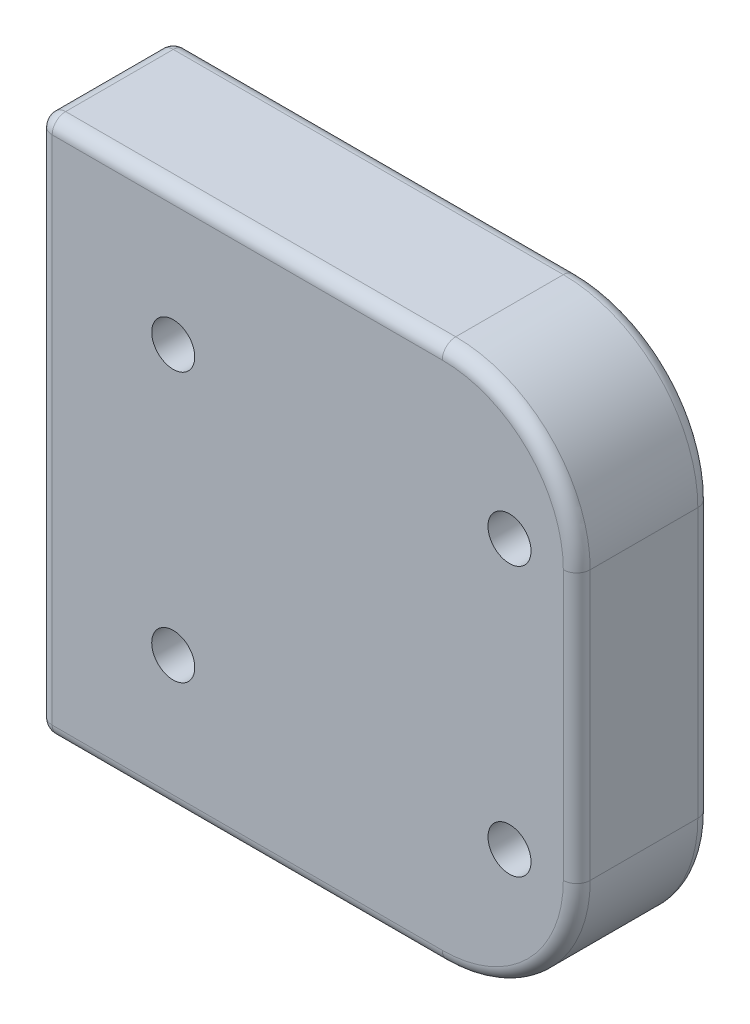
ISO-10303-21;
HEADER;
FILE_DESCRIPTION(('STEP AP214'),'2;1');
FILE_NAME('part.step','',(''),(''),'','','');
FILE_SCHEMA(('AUTOMOTIVE_DESIGN { 1 0 10303 214 1 1 1 1 }'));
ENDSEC;
DATA;
#1=APPLICATION_CONTEXT('core data for automotive mechanical design processes');
#2=APPLICATION_PROTOCOL_DEFINITION('international standard','automotive_design',2000,#1);
#3=PRODUCT_CONTEXT('',#1,'mechanical');
#4=PRODUCT('Part','Part','',(#3));
#5=PRODUCT_RELATED_PRODUCT_CATEGORY('part','',(#4));
#6=PRODUCT_DEFINITION_FORMATION('','',#4);
#7=PRODUCT_DEFINITION_CONTEXT('part definition',#1,'design');
#8=PRODUCT_DEFINITION('design','',#6,#7);
#9=PRODUCT_DEFINITION_SHAPE('','',#8);
#10=(LENGTH_UNIT() NAMED_UNIT(*) SI_UNIT(.MILLI.,.METRE.));
#11=(NAMED_UNIT(*) PLANE_ANGLE_UNIT() SI_UNIT($,.RADIAN.));
#12=(NAMED_UNIT(*) SI_UNIT($,.STERADIAN.) SOLID_ANGLE_UNIT());
#13=UNCERTAINTY_MEASURE_WITH_UNIT(LENGTH_MEASURE(1.E-05),#10,'distance_accuracy_value','');
#14=(GEOMETRIC_REPRESENTATION_CONTEXT(3) GLOBAL_UNCERTAINTY_ASSIGNED_CONTEXT((#13)) GLOBAL_UNIT_ASSIGNED_CONTEXT((#10,
#11,#12)) REPRESENTATION_CONTEXT('',''));
#15=CARTESIAN_POINT('',(0.,0.,0.));
#16=DIRECTION('',(0.,0.,1.));
#17=DIRECTION('',(1.,0.,0.));
#18=AXIS2_PLACEMENT_3D('',#15,#16,#17);
#19=CARTESIAN_POINT('',(20.,-20.,10.));
#20=DIRECTION('',(-1.,0.,0.));
#21=DIRECTION('',(0.,0.,1.));
#22=AXIS2_PLACEMENT_3D('',#19,#20,#21);
#23=PLANE('',#22);
#24=DIRECTION('',(0.,0.,-1.));
#25=VECTOR('',#24,1.);
#26=CARTESIAN_POINT('',(20.,-10.,10.));
#27=LINE('',#26,#25);
#28=CARTESIAN_POINT('',(20.,-10.,9.));
#29=VERTEX_POINT('',#28);
#30=CARTESIAN_POINT('',(20.,-10.,0.999999999999999));
#31=VERTEX_POINT('',#30);
#32=EDGE_CURVE('E174',#29,#31,#27,.T.);
#33=ORIENTED_EDGE('',*,*,#32,.T.);
#34=DIRECTION('',(0.,1.,0.));
#35=VECTOR('',#34,1.);
#36=CARTESIAN_POINT('',(20.,10.,0.999999999999999));
#37=LINE('',#36,#35);
#38=CARTESIAN_POINT('',(20.,10.,0.999999999999999));
#39=VERTEX_POINT('',#38);
#40=EDGE_CURVE('E195',#31,#39,#37,.T.);
#41=ORIENTED_EDGE('',*,*,#40,.T.);
#42=DIRECTION('',(0.,0.,-1.));
#43=VECTOR('',#42,1.);
#44=CARTESIAN_POINT('',(20.,10.,10.));
#45=LINE('',#44,#43);
#46=CARTESIAN_POINT('',(20.,10.,9.));
#47=VERTEX_POINT('',#46);
#48=EDGE_CURVE('E177',#39,#47,#45,.F.);
#49=ORIENTED_EDGE('',*,*,#48,.T.);
#50=DIRECTION('',(0.,1.,0.));
#51=VECTOR('',#50,1.);
#52=CARTESIAN_POINT('',(20.,-20.,9.));
#53=LINE('',#52,#51);
#54=EDGE_CURVE('E157',#47,#29,#53,.F.);
#55=ORIENTED_EDGE('',*,*,#54,.T.);
#56=EDGE_LOOP('',(#33,#41,#49,#55));
#57=FACE_BOUND('',#56,.T.);
#58=ADVANCED_FACE('F36',(#57),#23,.F.);
#59=CARTESIAN_POINT('',(-20.,20.,10.));
#60=DIRECTION('',(0.,-1.,0.));
#61=DIRECTION('',(0.,0.,-1.));
#62=AXIS2_PLACEMENT_3D('',#59,#60,#61);
#63=PLANE('',#62);
#64=DIRECTION('',(0.,0.,-1.));
#65=VECTOR('',#64,1.);
#66=CARTESIAN_POINT('',(10.,20.,10.));
#67=LINE('',#66,#65);
#68=CARTESIAN_POINT('',(10.,20.,9.));
#69=VERTEX_POINT('',#68);
#70=CARTESIAN_POINT('',(10.,20.,0.999999999999999));
#71=VERTEX_POINT('',#70);
#72=EDGE_CURVE('E173',#69,#71,#67,.T.);
#73=ORIENTED_EDGE('',*,*,#72,.T.);
#74=DIRECTION('',(-1.,0.,0.));
#75=VECTOR('',#74,1.);
#76=CARTESIAN_POINT('',(-20.,20.,0.999999999999999));
#77=LINE('',#76,#75);
#78=CARTESIAN_POINT('',(-19.,20.,0.999999999999999));
#79=VERTEX_POINT('',#78);
#80=EDGE_CURVE('E11',#71,#79,#77,.T.);
#81=ORIENTED_EDGE('',*,*,#80,.T.);
#82=DIRECTION('',(0.,0.,-1.));
#83=VECTOR('',#82,1.);
#84=CARTESIAN_POINT('',(-19.,20.,10.));
#85=LINE('',#84,#83);
#86=CARTESIAN_POINT('',(-19.,20.,9.));
#87=VERTEX_POINT('',#86);
#88=EDGE_CURVE('E52',#79,#87,#85,.F.);
#89=ORIENTED_EDGE('',*,*,#88,.T.);
#90=DIRECTION('',(-1.,0.,0.));
#91=VECTOR('',#90,1.);
#92=CARTESIAN_POINT('',(-20.,20.,9.));
#93=LINE('',#92,#91);
#94=EDGE_CURVE('E45',#87,#69,#93,.F.);
#95=ORIENTED_EDGE('',*,*,#94,.T.);
#96=EDGE_LOOP('',(#73,#81,#89,#95));
#97=FACE_BOUND('',#96,.T.);
#98=ADVANCED_FACE('F345',(#97),#63,.F.);
#99=CARTESIAN_POINT('',(-20.,-20.,10.));
#100=DIRECTION('',(1.,0.,0.));
#101=DIRECTION('',(0.,0.,-1.));
#102=AXIS2_PLACEMENT_3D('',#99,#100,#101);
#103=PLANE('',#102);
#104=DIRECTION('',(0.,-1.,0.));
#105=VECTOR('',#104,1.);
#106=CARTESIAN_POINT('',(-20.,-20.,0.999999999999999));
#107=LINE('',#106,#105);
#108=CARTESIAN_POINT('',(-20.,19.,0.999999999999999));
#109=VERTEX_POINT('',#108);
#110=CARTESIAN_POINT('',(-20.,-19.,0.999999999999999));
#111=VERTEX_POINT('',#110);
#112=EDGE_CURVE('E218',#109,#111,#107,.T.);
#113=ORIENTED_EDGE('',*,*,#112,.T.);
#114=DIRECTION('',(0.,0.,-1.));
#115=VECTOR('',#114,1.);
#116=CARTESIAN_POINT('',(-20.,-19.,10.));
#117=LINE('',#116,#115);
#118=CARTESIAN_POINT('',(-20.,-19.,9.));
#119=VERTEX_POINT('',#118);
#120=EDGE_CURVE('E221',#111,#119,#117,.F.);
#121=ORIENTED_EDGE('',*,*,#120,.T.);
#122=DIRECTION('',(0.,-1.,0.));
#123=VECTOR('',#122,1.);
#124=CARTESIAN_POINT('',(-20.,-20.,9.));
#125=LINE('',#124,#123);
#126=CARTESIAN_POINT('',(-20.,19.,9.));
#127=VERTEX_POINT('',#126);
#128=EDGE_CURVE('E216',#119,#127,#125,.F.);
#129=ORIENTED_EDGE('',*,*,#128,.T.);
#130=DIRECTION('',(0.,0.,-1.));
#131=VECTOR('',#130,1.);
#132=CARTESIAN_POINT('',(-20.,19.,10.));
#133=LINE('',#132,#131);
#134=EDGE_CURVE('E214',#127,#109,#133,.T.);
#135=ORIENTED_EDGE('',*,*,#134,.T.);
#136=EDGE_LOOP('',(#113,#121,#129,#135));
#137=FACE_BOUND('',#136,.T.);
#138=ADVANCED_FACE('F369',(#137),#103,.F.);
#139=CARTESIAN_POINT('',(-20.,-20.,10.));
#140=DIRECTION('',(0.,1.,0.));
#141=DIRECTION('',(0.,0.,1.));
#142=AXIS2_PLACEMENT_3D('',#139,#140,#141);
#143=PLANE('',#142);
#144=DIRECTION('',(0.,0.,-1.));
#145=VECTOR('',#144,1.);
#146=CARTESIAN_POINT('',(-19.,-20.,10.));
#147=LINE('',#146,#145);
#148=CARTESIAN_POINT('',(-19.,-20.,9.));
#149=VERTEX_POINT('',#148);
#150=CARTESIAN_POINT('',(-19.,-20.,0.999999999999999));
#151=VERTEX_POINT('',#150);
#152=EDGE_CURVE('E166',#149,#151,#147,.T.);
#153=ORIENTED_EDGE('',*,*,#152,.T.);
#154=DIRECTION('',(1.,0.,0.));
#155=VECTOR('',#154,1.);
#156=CARTESIAN_POINT('',(10.,-20.,0.999999999999999));
#157=LINE('',#156,#155);
#158=CARTESIAN_POINT('',(10.,-20.,0.999999999999999));
#159=VERTEX_POINT('',#158);
#160=EDGE_CURVE('E141',#151,#159,#157,.T.);
#161=ORIENTED_EDGE('',*,*,#160,.T.);
#162=DIRECTION('',(0.,0.,-1.));
#163=VECTOR('',#162,1.);
#164=CARTESIAN_POINT('',(10.,-20.,10.));
#165=LINE('',#164,#163);
#166=CARTESIAN_POINT('',(10.,-20.,9.));
#167=VERTEX_POINT('',#166);
#168=EDGE_CURVE('E163',#159,#167,#165,.F.);
#169=ORIENTED_EDGE('',*,*,#168,.T.);
#170=DIRECTION('',(1.,0.,0.));
#171=VECTOR('',#170,1.);
#172=CARTESIAN_POINT('',(-20.,-20.,9.));
#173=LINE('',#172,#171);
#174=EDGE_CURVE('E169',#167,#149,#173,.F.);
#175=ORIENTED_EDGE('',*,*,#174,.T.);
#176=EDGE_LOOP('',(#153,#161,#169,#175));
#177=FACE_BOUND('',#176,.T.);
#178=ADVANCED_FACE('F162',(#177),#143,.F.);
#179=CARTESIAN_POINT('',(0.,0.,10.));
#180=DIRECTION('',(0.,0.,-1.));
#181=DIRECTION('',(-1.,0.,0.));
#182=AXIS2_PLACEMENT_3D('',#179,#180,#181);
#183=PLANE('',#182);
#184=DIRECTION('',(0.,-1.,0.));
#185=VECTOR('',#184,1.);
#186=CARTESIAN_POINT('',(-19.,0.,10.));
#187=LINE('',#186,#185);
#188=CARTESIAN_POINT('',(-19.,19.,10.));
#189=VERTEX_POINT('',#188);
#190=CARTESIAN_POINT('',(-19.,-19.,10.));
#191=VERTEX_POINT('',#190);
#192=EDGE_CURVE('E201',#189,#191,#187,.T.);
#193=ORIENTED_EDGE('',*,*,#192,.T.);
#194=DIRECTION('',(1.,0.,0.));
#195=VECTOR('',#194,1.);
#196=CARTESIAN_POINT('',(0.,-19.,10.));
#197=LINE('',#196,#195);
#198=CARTESIAN_POINT('',(10.,-19.,10.));
#199=VERTEX_POINT('',#198);
#200=EDGE_CURVE('E211',#191,#199,#197,.T.);
#201=ORIENTED_EDGE('',*,*,#200,.T.);
#202=CARTESIAN_POINT('',(10.,-10.,10.));
#203=DIRECTION('',(0.,0.,-1.));
#204=DIRECTION('',(-1.,0.,0.));
#205=AXIS2_PLACEMENT_3D('',#202,#203,#204);
#206=CIRCLE('',#205,9.);
#207=CARTESIAN_POINT('',(19.,-10.,10.));
#208=VERTEX_POINT('',#207);
#209=EDGE_CURVE('E209',#199,#208,#206,.F.);
#210=ORIENTED_EDGE('',*,*,#209,.T.);
#211=DIRECTION('',(0.,1.,0.));
#212=VECTOR('',#211,1.);
#213=CARTESIAN_POINT('',(19.,0.,10.));
#214=LINE('',#213,#212);
#215=CARTESIAN_POINT('',(19.,10.,10.));
#216=VERTEX_POINT('',#215);
#217=EDGE_CURVE('E207',#208,#216,#214,.T.);
#218=ORIENTED_EDGE('',*,*,#217,.T.);
#219=CARTESIAN_POINT('',(10.,10.,10.));
#220=DIRECTION('',(0.,0.,-1.));
#221=DIRECTION('',(-1.,0.,0.));
#222=AXIS2_PLACEMENT_3D('',#219,#220,#221);
#223=CIRCLE('',#222,9.);
#224=CARTESIAN_POINT('',(10.,19.,10.));
#225=VERTEX_POINT('',#224);
#226=EDGE_CURVE('E205',#216,#225,#223,.F.);
#227=ORIENTED_EDGE('',*,*,#226,.T.);
#228=DIRECTION('',(-1.,0.,0.));
#229=VECTOR('',#228,1.);
#230=CARTESIAN_POINT('',(0.,19.,10.));
#231=LINE('',#230,#229);
#232=EDGE_CURVE('E203',#225,#189,#231,.T.);
#233=ORIENTED_EDGE('',*,*,#232,.T.);
#234=EDGE_LOOP('',(#193,#201,#210,#218,#227,#233));
#235=FACE_BOUND('',#234,.T.);
#236=CARTESIAN_POINT('',(-10.,-10.,10.));
#237=DIRECTION('',(0.,0.,1.));
#238=DIRECTION('',(-1.,0.,0.));
#239=AXIS2_PLACEMENT_3D('',#236,#237,#238);
#240=CIRCLE('',#239,1.59999999999998);
#241=CARTESIAN_POINT('',(-11.6,-10.,10.));
#242=VERTEX_POINT('',#241);
#243=EDGE_CURVE('E276',#242,#242,#240,.T.);
#244=ORIENTED_EDGE('',*,*,#243,.F.);
#245=EDGE_LOOP('',(#244));
#246=FACE_BOUND('',#245,.T.);
#247=CARTESIAN_POINT('',(15.,-10.,10.));
#248=DIRECTION('',(0.,0.,1.));
#249=DIRECTION('',(1.,0.,0.));
#250=AXIS2_PLACEMENT_3D('',#247,#248,#249);
#251=CIRCLE('',#250,1.60000000000001);
#252=CARTESIAN_POINT('',(16.6,-10.,10.));
#253=VERTEX_POINT('',#252);
#254=EDGE_CURVE('E286',#253,#253,#251,.T.);
#255=ORIENTED_EDGE('',*,*,#254,.F.);
#256=EDGE_LOOP('',(#255));
#257=FACE_BOUND('',#256,.T.);
#258=CARTESIAN_POINT('',(15.,10.,10.));
#259=DIRECTION('',(0.,0.,1.));
#260=DIRECTION('',(-1.,0.,0.));
#261=AXIS2_PLACEMENT_3D('',#258,#259,#260);
#262=CIRCLE('',#261,1.6);
#263=CARTESIAN_POINT('',(13.4,10.,10.));
#264=VERTEX_POINT('',#263);
#265=EDGE_CURVE('E626',#264,#264,#262,.T.);
#266=ORIENTED_EDGE('',*,*,#265,.F.);
#267=EDGE_LOOP('',(#266));
#268=FACE_BOUND('',#267,.T.);
#269=CARTESIAN_POINT('',(-10.,10.,10.));
#270=DIRECTION('',(0.,0.,1.));
#271=DIRECTION('',(1.,0.,0.));
#272=AXIS2_PLACEMENT_3D('',#269,#270,#271);
#273=CIRCLE('',#272,1.6);
#274=CARTESIAN_POINT('',(-8.4,10.,10.));
#275=VERTEX_POINT('',#274);
#276=EDGE_CURVE('E293',#275,#275,#273,.T.);
#277=ORIENTED_EDGE('',*,*,#276,.F.);
#278=EDGE_LOOP('',(#277));
#279=FACE_BOUND('',#278,.T.);
#280=ADVANCED_FACE('F363',(#235,#246,#257,#268,#279),#183,.F.);
#281=CARTESIAN_POINT('',(0.,0.,0.));
#282=DIRECTION('',(0.,0.,-1.));
#283=DIRECTION('',(-1.,0.,0.));
#284=AXIS2_PLACEMENT_3D('',#281,#282,#283);
#285=PLANE('',#284);
#286=CARTESIAN_POINT('',(10.,-10.,0.));
#287=DIRECTION('',(0.,0.,-1.));
#288=DIRECTION('',(-1.,0.,0.));
#289=AXIS2_PLACEMENT_3D('',#286,#287,#288);
#290=CIRCLE('',#289,9.);
#291=CARTESIAN_POINT('',(19.,-10.,0.));
#292=VERTEX_POINT('',#291);
#293=CARTESIAN_POINT('',(10.,-19.,0.));
#294=VERTEX_POINT('',#293);
#295=EDGE_CURVE('E190',#292,#294,#290,.T.);
#296=ORIENTED_EDGE('',*,*,#295,.T.);
#297=DIRECTION('',(1.,0.,0.));
#298=VECTOR('',#297,1.);
#299=CARTESIAN_POINT('',(-20.,-19.,0.));
#300=LINE('',#299,#298);
#301=CARTESIAN_POINT('',(-19.,-19.,0.));
#302=VERTEX_POINT('',#301);
#303=EDGE_CURVE('E143',#294,#302,#300,.F.);
#304=ORIENTED_EDGE('',*,*,#303,.T.);
#305=DIRECTION('',(0.,-1.,0.));
#306=VECTOR('',#305,1.);
#307=CARTESIAN_POINT('',(-19.,20.,0.));
#308=LINE('',#307,#306);
#309=CARTESIAN_POINT('',(-19.,19.,0.));
#310=VERTEX_POINT('',#309);
#311=EDGE_CURVE('E184',#302,#310,#308,.F.);
#312=ORIENTED_EDGE('',*,*,#311,.T.);
#313=DIRECTION('',(-1.,0.,0.));
#314=VECTOR('',#313,1.);
#315=CARTESIAN_POINT('',(10.,19.,0.));
#316=LINE('',#315,#314);
#317=CARTESIAN_POINT('',(10.,19.,0.));
#318=VERTEX_POINT('',#317);
#319=EDGE_CURVE('E168',#310,#318,#316,.F.);
#320=ORIENTED_EDGE('',*,*,#319,.T.);
#321=CARTESIAN_POINT('',(10.,10.,0.));
#322=DIRECTION('',(0.,0.,-1.));
#323=DIRECTION('',(-1.,0.,0.));
#324=AXIS2_PLACEMENT_3D('',#321,#322,#323);
#325=CIRCLE('',#324,9.);
#326=CARTESIAN_POINT('',(19.,10.,0.));
#327=VERTEX_POINT('',#326);
#328=EDGE_CURVE('E186',#318,#327,#325,.T.);
#329=ORIENTED_EDGE('',*,*,#328,.T.);
#330=DIRECTION('',(0.,1.,0.));
#331=VECTOR('',#330,1.);
#332=CARTESIAN_POINT('',(19.,-10.,0.));
#333=LINE('',#332,#331);
#334=EDGE_CURVE('E188',#327,#292,#333,.F.);
#335=ORIENTED_EDGE('',*,*,#334,.T.);
#336=EDGE_LOOP('',(#296,#304,#312,#320,#329,#335));
#337=FACE_BOUND('',#336,.T.);
#338=CARTESIAN_POINT('',(-10.,-10.,0.));
#339=DIRECTION('',(0.,0.,1.));
#340=DIRECTION('',(-1.,0.,0.));
#341=AXIS2_PLACEMENT_3D('',#338,#339,#340);
#342=CIRCLE('',#341,1.59999999999998);
#343=CARTESIAN_POINT('',(-11.6,-10.,0.));
#344=VERTEX_POINT('',#343);
#345=EDGE_CURVE('E281',#344,#344,#342,.T.);
#346=ORIENTED_EDGE('',*,*,#345,.T.);
#347=EDGE_LOOP('',(#346));
#348=FACE_BOUND('',#347,.T.);
#349=CARTESIAN_POINT('',(15.,-10.,0.));
#350=DIRECTION('',(0.,0.,1.));
#351=DIRECTION('',(1.,0.,0.));
#352=AXIS2_PLACEMENT_3D('',#349,#350,#351);
#353=CIRCLE('',#352,1.60000000000001);
#354=CARTESIAN_POINT('',(16.6,-10.,0.));
#355=VERTEX_POINT('',#354);
#356=EDGE_CURVE('E628',#355,#355,#353,.T.);
#357=ORIENTED_EDGE('',*,*,#356,.T.);
#358=EDGE_LOOP('',(#357));
#359=FACE_BOUND('',#358,.T.);
#360=CARTESIAN_POINT('',(15.,10.,0.));
#361=DIRECTION('',(0.,0.,1.));
#362=DIRECTION('',(-1.,0.,0.));
#363=AXIS2_PLACEMENT_3D('',#360,#361,#362);
#364=CIRCLE('',#363,1.6);
#365=CARTESIAN_POINT('',(13.4,10.,0.));
#366=VERTEX_POINT('',#365);
#367=EDGE_CURVE('E295',#366,#366,#364,.T.);
#368=ORIENTED_EDGE('',*,*,#367,.T.);
#369=EDGE_LOOP('',(#368));
#370=FACE_BOUND('',#369,.T.);
#371=CARTESIAN_POINT('',(-10.,10.,0.));
#372=DIRECTION('',(0.,0.,1.));
#373=DIRECTION('',(1.,0.,0.));
#374=AXIS2_PLACEMENT_3D('',#371,#372,#373);
#375=CIRCLE('',#374,1.6);
#376=CARTESIAN_POINT('',(-8.4,10.,0.));
#377=VERTEX_POINT('',#376);
#378=EDGE_CURVE('E290',#377,#377,#375,.T.);
#379=ORIENTED_EDGE('',*,*,#378,.T.);
#380=EDGE_LOOP('',(#379));
#381=FACE_BOUND('',#380,.T.);
#382=ADVANCED_FACE('F333',(#337,#348,#359,#370,#381),#285,.T.);
#383=CARTESIAN_POINT('',(-10.,10.,0.));
#384=DIRECTION('',(0.,0.,1.));
#385=DIRECTION('',(1.,0.,0.));
#386=AXIS2_PLACEMENT_3D('',#383,#384,#385);
#387=CYLINDRICAL_SURFACE('',#386,1.6);
#388=ORIENTED_EDGE('',*,*,#378,.F.);
#389=EDGE_LOOP('',(#388));
#390=FACE_BOUND('',#389,.T.);
#391=ORIENTED_EDGE('',*,*,#276,.T.);
#392=EDGE_LOOP('',(#391));
#393=FACE_BOUND('',#392,.T.);
#394=ADVANCED_FACE('F456',(#390,#393),#387,.F.);
#395=CARTESIAN_POINT('',(15.,10.,0.));
#396=DIRECTION('',(0.,0.,1.));
#397=DIRECTION('',(1.,0.,0.));
#398=AXIS2_PLACEMENT_3D('',#395,#396,#397);
#399=CYLINDRICAL_SURFACE('',#398,1.6);
#400=ORIENTED_EDGE('',*,*,#367,.F.);
#401=EDGE_LOOP('',(#400));
#402=FACE_BOUND('',#401,.T.);
#403=ORIENTED_EDGE('',*,*,#265,.T.);
#404=EDGE_LOOP('',(#403));
#405=FACE_BOUND('',#404,.T.);
#406=ADVANCED_FACE('F448',(#402,#405),#399,.F.);
#407=CARTESIAN_POINT('',(15.,-10.,0.));
#408=DIRECTION('',(0.,0.,1.));
#409=DIRECTION('',(1.,0.,0.));
#410=AXIS2_PLACEMENT_3D('',#407,#408,#409);
#411=CYLINDRICAL_SURFACE('',#410,1.60000000000001);
#412=ORIENTED_EDGE('',*,*,#356,.F.);
#413=EDGE_LOOP('',(#412));
#414=FACE_BOUND('',#413,.T.);
#415=ORIENTED_EDGE('',*,*,#254,.T.);
#416=EDGE_LOOP('',(#415));
#417=FACE_BOUND('',#416,.T.);
#418=ADVANCED_FACE('F440',(#414,#417),#411,.F.);
#419=CARTESIAN_POINT('',(-10.,-10.,0.));
#420=DIRECTION('',(0.,0.,1.));
#421=DIRECTION('',(1.,0.,0.));
#422=AXIS2_PLACEMENT_3D('',#419,#420,#421);
#423=CYLINDRICAL_SURFACE('',#422,1.59999999999998);
#424=ORIENTED_EDGE('',*,*,#345,.F.);
#425=EDGE_LOOP('',(#424));
#426=FACE_BOUND('',#425,.T.);
#427=ORIENTED_EDGE('',*,*,#243,.T.);
#428=EDGE_LOOP('',(#427));
#429=FACE_BOUND('',#428,.T.);
#430=ADVANCED_FACE('F385',(#426,#429),#423,.F.);
#431=CARTESIAN_POINT('',(10.,-10.,10.));
#432=DIRECTION('',(0.,0.,-1.));
#433=DIRECTION('',(-1.,0.,0.));
#434=AXIS2_PLACEMENT_3D('',#431,#432,#433);
#435=CYLINDRICAL_SURFACE('',#434,10.);
#436=ORIENTED_EDGE('',*,*,#168,.F.);
#437=CARTESIAN_POINT('',(10.,-10.,0.999999999999999));
#438=DIRECTION('',(0.,0.,-1.));
#439=DIRECTION('',(-1.,0.,0.));
#440=AXIS2_PLACEMENT_3D('',#437,#438,#439);
#441=CIRCLE('',#440,10.);
#442=EDGE_CURVE('E149',#159,#31,#441,.F.);
#443=ORIENTED_EDGE('',*,*,#442,.T.);
#444=ORIENTED_EDGE('',*,*,#32,.F.);
#445=CARTESIAN_POINT('',(10.,-10.,9.));
#446=DIRECTION('',(0.,0.,-1.));
#447=DIRECTION('',(-1.,0.,0.));
#448=AXIS2_PLACEMENT_3D('',#445,#446,#447);
#449=CIRCLE('',#448,10.);
#450=EDGE_CURVE('E158',#29,#167,#449,.T.);
#451=ORIENTED_EDGE('',*,*,#450,.T.);
#452=EDGE_LOOP('',(#436,#443,#444,#451));
#453=FACE_BOUND('',#452,.T.);
#454=ADVANCED_FACE('F171',(#453),#435,.T.);
#455=CARTESIAN_POINT('',(10.,10.,10.));
#456=DIRECTION('',(0.,0.,-1.));
#457=DIRECTION('',(-1.,0.,0.));
#458=AXIS2_PLACEMENT_3D('',#455,#456,#457);
#459=CYLINDRICAL_SURFACE('',#458,10.);
#460=ORIENTED_EDGE('',*,*,#48,.F.);
#461=CARTESIAN_POINT('',(10.,10.,0.999999999999999));
#462=DIRECTION('',(0.,0.,-1.));
#463=DIRECTION('',(-1.,0.,0.));
#464=AXIS2_PLACEMENT_3D('',#461,#462,#463);
#465=CIRCLE('',#464,10.);
#466=EDGE_CURVE('E199',#39,#71,#465,.F.);
#467=ORIENTED_EDGE('',*,*,#466,.T.);
#468=ORIENTED_EDGE('',*,*,#72,.F.);
#469=CARTESIAN_POINT('',(10.,10.,9.));
#470=DIRECTION('',(0.,0.,-1.));
#471=DIRECTION('',(-1.,0.,0.));
#472=AXIS2_PLACEMENT_3D('',#469,#470,#471);
#473=CIRCLE('',#472,10.);
#474=EDGE_CURVE('E197',#69,#47,#473,.T.);
#475=ORIENTED_EDGE('',*,*,#474,.T.);
#476=EDGE_LOOP('',(#460,#467,#468,#475));
#477=FACE_BOUND('',#476,.T.);
#478=ADVANCED_FACE('F344',(#477),#459,.T.);
#479=CARTESIAN_POINT('',(10.,10.,9.));
#480=DIRECTION('',(0.,0.,-1.));
#481=DIRECTION('',(-1.,0.,0.));
#482=AXIS2_PLACEMENT_3D('',#479,#480,#481);
#483=TOROIDAL_SURFACE('',#482,9.,1.);
#484=CARTESIAN_POINT('',(19.,10.,9.));
#485=DIRECTION('',(0.,-1.,0.));
#486=DIRECTION('',(0.,0.,-1.));
#487=AXIS2_PLACEMENT_3D('',#484,#485,#486);
#488=CIRCLE('',#487,1.);
#489=EDGE_CURVE('E269',#47,#216,#488,.T.);
#490=ORIENTED_EDGE('',*,*,#489,.F.);
#491=ORIENTED_EDGE('',*,*,#474,.F.);
#492=CARTESIAN_POINT('',(10.,19.,9.));
#493=DIRECTION('',(-1.,0.,0.));
#494=DIRECTION('',(0.,0.,1.));
#495=AXIS2_PLACEMENT_3D('',#492,#493,#494);
#496=CIRCLE('',#495,1.);
#497=EDGE_CURVE('E40',#225,#69,#496,.T.);
#498=ORIENTED_EDGE('',*,*,#497,.F.);
#499=ORIENTED_EDGE('',*,*,#226,.F.);
#500=EDGE_LOOP('',(#490,#491,#498,#499));
#501=FACE_BOUND('',#500,.T.);
#502=ADVANCED_FACE('F38',(#501),#483,.T.);
#503=CARTESIAN_POINT('',(0.,19.,9.));
#504=DIRECTION('',(-1.,0.,0.));
#505=DIRECTION('',(0.,0.,1.));
#506=AXIS2_PLACEMENT_3D('',#503,#504,#505);
#507=CYLINDRICAL_SURFACE('',#506,1.);
#508=ORIENTED_EDGE('',*,*,#497,.T.);
#509=ORIENTED_EDGE('',*,*,#94,.F.);
#510=CARTESIAN_POINT('',(-19.,19.,9.));
#511=DIRECTION('',(-1.,0.,0.));
#512=DIRECTION('',(0.,0.,1.));
#513=AXIS2_PLACEMENT_3D('',#510,#511,#512);
#514=CIRCLE('',#513,1.);
#515=EDGE_CURVE('E267',#189,#87,#514,.T.);
#516=ORIENTED_EDGE('',*,*,#515,.F.);
#517=ORIENTED_EDGE('',*,*,#232,.F.);
#518=EDGE_LOOP('',(#508,#509,#516,#517));
#519=FACE_BOUND('',#518,.T.);
#520=ADVANCED_FACE('F361',(#519),#507,.T.);
#521=CARTESIAN_POINT('',(19.,0.,9.));
#522=DIRECTION('',(0.,1.,0.));
#523=DIRECTION('',(0.,0.,1.));
#524=AXIS2_PLACEMENT_3D('',#521,#522,#523);
#525=CYLINDRICAL_SURFACE('',#524,1.);
#526=ORIENTED_EDGE('',*,*,#489,.T.);
#527=ORIENTED_EDGE('',*,*,#217,.F.);
#528=CARTESIAN_POINT('',(19.,-10.,9.));
#529=DIRECTION('',(0.,-1.,0.));
#530=DIRECTION('',(0.,0.,-1.));
#531=AXIS2_PLACEMENT_3D('',#528,#529,#530);
#532=CIRCLE('',#531,1.);
#533=EDGE_CURVE('E264',#29,#208,#532,.T.);
#534=ORIENTED_EDGE('',*,*,#533,.F.);
#535=ORIENTED_EDGE('',*,*,#54,.F.);
#536=EDGE_LOOP('',(#526,#527,#534,#535));
#537=FACE_BOUND('',#536,.T.);
#538=ADVANCED_FACE('F306',(#537),#525,.T.);
#539=CARTESIAN_POINT('',(-19.,19.,9.));
#540=DIRECTION('',(0.,1.,0.));
#541=DIRECTION('',(0.,0.,1.));
#542=AXIS2_PLACEMENT_3D('',#539,#540,#541);
#543=SPHERICAL_SURFACE('',#542,1.);
#544=CARTESIAN_POINT('',(-19.,19.,9.));
#545=DIRECTION('',(0.,1.,0.));
#546=DIRECTION('',(0.,0.,1.));
#547=AXIS2_PLACEMENT_3D('',#544,#545,#546);
#548=CIRCLE('',#547,1.);
#549=EDGE_CURVE('E258',#189,#127,#548,.F.);
#550=ORIENTED_EDGE('',*,*,#549,.F.);
#551=ORIENTED_EDGE('',*,*,#515,.T.);
#552=CARTESIAN_POINT('',(-19.,19.,9.));
#553=DIRECTION('',(0.,0.,1.));
#554=DIRECTION('',(1.,0.,0.));
#555=AXIS2_PLACEMENT_3D('',#552,#553,#554);
#556=CIRCLE('',#555,1.);
#557=EDGE_CURVE('E261',#127,#87,#556,.F.);
#558=ORIENTED_EDGE('',*,*,#557,.F.);
#559=EDGE_LOOP('',(#550,#551,#558));
#560=FACE_BOUND('',#559,.T.);
#561=ADVANCED_FACE('F358',(#560),#543,.T.);
#562=CARTESIAN_POINT('',(10.,-10.,9.));
#563=DIRECTION('',(0.,0.,-1.));
#564=DIRECTION('',(-1.,0.,0.));
#565=AXIS2_PLACEMENT_3D('',#562,#563,#564);
#566=TOROIDAL_SURFACE('',#565,9.,1.);
#567=ORIENTED_EDGE('',*,*,#533,.T.);
#568=ORIENTED_EDGE('',*,*,#209,.F.);
#569=CARTESIAN_POINT('',(10.,-19.,9.));
#570=DIRECTION('',(-1.,0.,0.));
#571=DIRECTION('',(0.,0.,1.));
#572=AXIS2_PLACEMENT_3D('',#569,#570,#571);
#573=CIRCLE('',#572,1.);
#574=EDGE_CURVE('E256',#167,#199,#573,.T.);
#575=ORIENTED_EDGE('',*,*,#574,.F.);
#576=ORIENTED_EDGE('',*,*,#450,.F.);
#577=EDGE_LOOP('',(#567,#568,#575,#576));
#578=FACE_BOUND('',#577,.T.);
#579=ADVANCED_FACE('F309',(#578),#566,.T.);
#580=CARTESIAN_POINT('',(-19.,19.,10.));
#581=DIRECTION('',(0.,0.,-1.));
#582=DIRECTION('',(-1.,0.,0.));
#583=AXIS2_PLACEMENT_3D('',#580,#581,#582);
#584=CYLINDRICAL_SURFACE('',#583,1.);
#585=ORIENTED_EDGE('',*,*,#557,.T.);
#586=ORIENTED_EDGE('',*,*,#88,.F.);
#587=CARTESIAN_POINT('',(-19.,19.,0.999999999999999));
#588=DIRECTION('',(0.,0.,-1.));
#589=DIRECTION('',(-1.,0.,0.));
#590=AXIS2_PLACEMENT_3D('',#587,#588,#589);
#591=CIRCLE('',#590,1.);
#592=EDGE_CURVE('E250',#109,#79,#591,.T.);
#593=ORIENTED_EDGE('',*,*,#592,.F.);
#594=ORIENTED_EDGE('',*,*,#134,.F.);
#595=EDGE_LOOP('',(#585,#586,#593,#594));
#596=FACE_BOUND('',#595,.T.);
#597=ADVANCED_FACE('F354',(#596),#584,.T.);
#598=CARTESIAN_POINT('',(-19.,0.,9.));
#599=DIRECTION('',(0.,-1.,0.));
#600=DIRECTION('',(0.,0.,-1.));
#601=AXIS2_PLACEMENT_3D('',#598,#599,#600);
#602=CYLINDRICAL_SURFACE('',#601,1.);
#603=ORIENTED_EDGE('',*,*,#549,.T.);
#604=ORIENTED_EDGE('',*,*,#128,.F.);
#605=CARTESIAN_POINT('',(-19.,-19.,9.));
#606=DIRECTION('',(0.,-1.,0.));
#607=DIRECTION('',(0.,0.,-1.));
#608=AXIS2_PLACEMENT_3D('',#605,#606,#607);
#609=CIRCLE('',#608,1.);
#610=EDGE_CURVE('E247',#191,#119,#609,.T.);
#611=ORIENTED_EDGE('',*,*,#610,.F.);
#612=ORIENTED_EDGE('',*,*,#192,.F.);
#613=EDGE_LOOP('',(#603,#604,#611,#612));
#614=FACE_BOUND('',#613,.T.);
#615=ADVANCED_FACE('F366',(#614),#602,.T.);
#616=CARTESIAN_POINT('',(0.,-19.,9.));
#617=DIRECTION('',(1.,0.,0.));
#618=DIRECTION('',(0.,0.,-1.));
#619=AXIS2_PLACEMENT_3D('',#616,#617,#618);
#620=CYLINDRICAL_SURFACE('',#619,1.);
#621=ORIENTED_EDGE('',*,*,#574,.T.);
#622=ORIENTED_EDGE('',*,*,#200,.F.);
#623=CARTESIAN_POINT('',(-19.,-19.,9.));
#624=DIRECTION('',(-1.,0.,0.));
#625=DIRECTION('',(0.,0.,1.));
#626=AXIS2_PLACEMENT_3D('',#623,#624,#625);
#627=CIRCLE('',#626,1.);
#628=EDGE_CURVE('E244',#149,#191,#627,.T.);
#629=ORIENTED_EDGE('',*,*,#628,.F.);
#630=ORIENTED_EDGE('',*,*,#174,.F.);
#631=EDGE_LOOP('',(#621,#622,#629,#630));
#632=FACE_BOUND('',#631,.T.);
#633=ADVANCED_FACE('F314',(#632),#620,.T.);
#634=CARTESIAN_POINT('',(-20.,19.,0.999999999999999));
#635=DIRECTION('',(1.,0.,0.));
#636=DIRECTION('',(0.,0.,-1.));
#637=AXIS2_PLACEMENT_3D('',#634,#635,#636);
#638=CYLINDRICAL_SURFACE('',#637,1.);
#639=CARTESIAN_POINT('',(-19.,19.,0.999999999999999));
#640=DIRECTION('',(-1.,0.,0.));
#641=DIRECTION('',(0.,0.,1.));
#642=AXIS2_PLACEMENT_3D('',#639,#640,#641);
#643=CIRCLE('',#642,1.);
#644=EDGE_CURVE('E253',#79,#310,#643,.T.);
#645=ORIENTED_EDGE('',*,*,#644,.F.);
#646=ORIENTED_EDGE('',*,*,#80,.F.);
#647=CARTESIAN_POINT('',(10.,19.,1.));
#648=DIRECTION('',(1.,0.,0.));
#649=DIRECTION('',(0.,0.,-1.));
#650=AXIS2_PLACEMENT_3D('',#647,#648,#649);
#651=CIRCLE('',#650,1.);
#652=EDGE_CURVE('E241',#318,#71,#651,.T.);
#653=ORIENTED_EDGE('',*,*,#652,.F.);
#654=ORIENTED_EDGE('',*,*,#319,.F.);
#655=EDGE_LOOP('',(#645,#646,#653,#654));
#656=FACE_BOUND('',#655,.T.);
#657=ADVANCED_FACE('F348',(#656),#638,.T.);
#658=CARTESIAN_POINT('',(-19.,19.,1.));
#659=DIRECTION('',(0.,1.,0.));
#660=DIRECTION('',(0.,0.,1.));
#661=AXIS2_PLACEMENT_3D('',#658,#659,#660);
#662=SPHERICAL_SURFACE('',#661,1.);
#663=ORIENTED_EDGE('',*,*,#592,.T.);
#664=ORIENTED_EDGE('',*,*,#644,.T.);
#665=CARTESIAN_POINT('',(-19.,19.,1.));
#666=DIRECTION('',(0.,1.,0.));
#667=DIRECTION('',(0.,0.,1.));
#668=AXIS2_PLACEMENT_3D('',#665,#666,#667);
#669=CIRCLE('',#668,1.);
#670=EDGE_CURVE('E238',#109,#310,#669,.F.);
#671=ORIENTED_EDGE('',*,*,#670,.F.);
#672=EDGE_LOOP('',(#663,#664,#671));
#673=FACE_BOUND('',#672,.T.);
#674=ADVANCED_FACE('F351',(#673),#662,.T.);
#675=CARTESIAN_POINT('',(-19.,-19.,9.));
#676=DIRECTION('',(0.,0.,1.));
#677=DIRECTION('',(1.,0.,0.));
#678=AXIS2_PLACEMENT_3D('',#675,#676,#677);
#679=SPHERICAL_SURFACE('',#678,1.);
#680=ORIENTED_EDGE('',*,*,#628,.T.);
#681=ORIENTED_EDGE('',*,*,#610,.T.);
#682=CARTESIAN_POINT('',(-19.,-19.,9.));
#683=DIRECTION('',(0.,0.,1.));
#684=DIRECTION('',(1.,0.,0.));
#685=AXIS2_PLACEMENT_3D('',#682,#683,#684);
#686=CIRCLE('',#685,1.);
#687=EDGE_CURVE('E235',#149,#119,#686,.F.);
#688=ORIENTED_EDGE('',*,*,#687,.F.);
#689=EDGE_LOOP('',(#680,#681,#688));
#690=FACE_BOUND('',#689,.T.);
#691=ADVANCED_FACE('F318',(#690),#679,.T.);
#692=CARTESIAN_POINT('',(10.,10.,0.999999999999999));
#693=DIRECTION('',(0.,0.,-1.));
#694=DIRECTION('',(-1.,0.,0.));
#695=AXIS2_PLACEMENT_3D('',#692,#693,#694);
#696=TOROIDAL_SURFACE('',#695,9.,1.);
#697=ORIENTED_EDGE('',*,*,#652,.T.);
#698=ORIENTED_EDGE('',*,*,#466,.F.);
#699=CARTESIAN_POINT('',(19.,10.,1.));
#700=DIRECTION('',(0.,-1.,0.));
#701=DIRECTION('',(0.,0.,-1.));
#702=AXIS2_PLACEMENT_3D('',#699,#700,#701);
#703=CIRCLE('',#702,1.);
#704=EDGE_CURVE('E232',#327,#39,#703,.T.);
#705=ORIENTED_EDGE('',*,*,#704,.F.);
#706=ORIENTED_EDGE('',*,*,#328,.F.);
#707=EDGE_LOOP('',(#697,#698,#705,#706));
#708=FACE_BOUND('',#707,.T.);
#709=ADVANCED_FACE('F341',(#708),#696,.T.);
#710=CARTESIAN_POINT('',(-19.,-20.,0.999999999999999));
#711=DIRECTION('',(0.,1.,0.));
#712=DIRECTION('',(0.,0.,1.));
#713=AXIS2_PLACEMENT_3D('',#710,#711,#712);
#714=CYLINDRICAL_SURFACE('',#713,1.);
#715=ORIENTED_EDGE('',*,*,#670,.T.);
#716=ORIENTED_EDGE('',*,*,#311,.F.);
#717=CARTESIAN_POINT('',(-19.,-19.,0.999999999999999));
#718=DIRECTION('',(0.,-1.,0.));
#719=DIRECTION('',(0.,0.,-1.));
#720=AXIS2_PLACEMENT_3D('',#717,#718,#719);
#721=CIRCLE('',#720,1.);
#722=EDGE_CURVE('E229',#111,#302,#721,.T.);
#723=ORIENTED_EDGE('',*,*,#722,.F.);
#724=ORIENTED_EDGE('',*,*,#112,.F.);
#725=EDGE_LOOP('',(#715,#716,#723,#724));
#726=FACE_BOUND('',#725,.T.);
#727=ADVANCED_FACE('F329',(#726),#714,.T.);
#728=CARTESIAN_POINT('',(-19.,-19.,10.));
#729=DIRECTION('',(0.,0.,-1.));
#730=DIRECTION('',(-1.,0.,0.));
#731=AXIS2_PLACEMENT_3D('',#728,#729,#730);
#732=CYLINDRICAL_SURFACE('',#731,1.);
#733=ORIENTED_EDGE('',*,*,#687,.T.);
#734=ORIENTED_EDGE('',*,*,#120,.F.);
#735=CARTESIAN_POINT('',(-19.,-19.,0.999999999999999));
#736=DIRECTION('',(0.,0.,-1.));
#737=DIRECTION('',(-1.,0.,0.));
#738=AXIS2_PLACEMENT_3D('',#735,#736,#737);
#739=CIRCLE('',#738,1.);
#740=EDGE_CURVE('E227',#151,#111,#739,.T.);
#741=ORIENTED_EDGE('',*,*,#740,.F.);
#742=ORIENTED_EDGE('',*,*,#152,.F.);
#743=EDGE_LOOP('',(#733,#734,#741,#742));
#744=FACE_BOUND('',#743,.T.);
#745=ADVANCED_FACE('F321',(#744),#732,.T.);
#746=CARTESIAN_POINT('',(19.,-20.,0.999999999999999));
#747=DIRECTION('',(0.,-1.,0.));
#748=DIRECTION('',(0.,0.,-1.));
#749=AXIS2_PLACEMENT_3D('',#746,#747,#748);
#750=CYLINDRICAL_SURFACE('',#749,1.);
#751=ORIENTED_EDGE('',*,*,#704,.T.);
#752=ORIENTED_EDGE('',*,*,#40,.F.);
#753=CARTESIAN_POINT('',(19.,-10.,1.));
#754=DIRECTION('',(0.,-1.,0.));
#755=DIRECTION('',(0.,0.,-1.));
#756=AXIS2_PLACEMENT_3D('',#753,#754,#755);
#757=CIRCLE('',#756,1.);
#758=EDGE_CURVE('E152',#292,#31,#757,.T.);
#759=ORIENTED_EDGE('',*,*,#758,.F.);
#760=ORIENTED_EDGE('',*,*,#334,.F.);
#761=EDGE_LOOP('',(#751,#752,#759,#760));
#762=FACE_BOUND('',#761,.T.);
#763=ADVANCED_FACE('F339',(#762),#750,.T.);
#764=CARTESIAN_POINT('',(-19.,-19.,1.));
#765=DIRECTION('',(-1.,0.,0.));
#766=DIRECTION('',(0.,0.,1.));
#767=AXIS2_PLACEMENT_3D('',#764,#765,#766);
#768=SPHERICAL_SURFACE('',#767,1.);
#769=ORIENTED_EDGE('',*,*,#740,.T.);
#770=ORIENTED_EDGE('',*,*,#722,.T.);
#771=CARTESIAN_POINT('',(-19.,-19.,1.));
#772=DIRECTION('',(-1.,0.,0.));
#773=DIRECTION('',(0.,0.,1.));
#774=AXIS2_PLACEMENT_3D('',#771,#772,#773);
#775=CIRCLE('',#774,1.);
#776=EDGE_CURVE('E146',#151,#302,#775,.F.);
#777=ORIENTED_EDGE('',*,*,#776,.F.);
#778=EDGE_LOOP('',(#769,#770,#777));
#779=FACE_BOUND('',#778,.T.);
#780=ADVANCED_FACE('F325',(#779),#768,.T.);
#781=CARTESIAN_POINT('',(10.,-10.,0.999999999999999));
#782=DIRECTION('',(0.,0.,-1.));
#783=DIRECTION('',(-1.,0.,0.));
#784=AXIS2_PLACEMENT_3D('',#781,#782,#783);
#785=TOROIDAL_SURFACE('',#784,9.,1.);
#786=ORIENTED_EDGE('',*,*,#758,.T.);
#787=ORIENTED_EDGE('',*,*,#442,.F.);
#788=CARTESIAN_POINT('',(10.,-19.,1.));
#789=DIRECTION('',(-1.,0.,0.));
#790=DIRECTION('',(0.,0.,1.));
#791=AXIS2_PLACEMENT_3D('',#788,#789,#790);
#792=CIRCLE('',#791,1.);
#793=EDGE_CURVE('E137',#294,#159,#792,.T.);
#794=ORIENTED_EDGE('',*,*,#793,.F.);
#795=ORIENTED_EDGE('',*,*,#295,.F.);
#796=EDGE_LOOP('',(#786,#787,#794,#795));
#797=FACE_BOUND('',#796,.T.);
#798=ADVANCED_FACE('F150',(#797),#785,.T.);
#799=CARTESIAN_POINT('',(-20.,-19.,0.999999999999999));
#800=DIRECTION('',(-1.,0.,0.));
#801=DIRECTION('',(0.,0.,1.));
#802=AXIS2_PLACEMENT_3D('',#799,#800,#801);
#803=CYLINDRICAL_SURFACE('',#802,1.);
#804=ORIENTED_EDGE('',*,*,#776,.T.);
#805=ORIENTED_EDGE('',*,*,#303,.F.);
#806=ORIENTED_EDGE('',*,*,#793,.T.);
#807=ORIENTED_EDGE('',*,*,#160,.F.);
#808=EDGE_LOOP('',(#804,#805,#806,#807));
#809=FACE_BOUND('',#808,.T.);
#810=ADVANCED_FACE('F139',(#809),#803,.T.);
#811=CLOSED_SHELL('',(#58,#98,#138,#178,#280,#382,#394,#406,#418,#430,#454,#478,#502,#520,#538,
#561,#579,#597,#615,#633,#657,#674,#691,#709,#727,#745,#763,#780,#798,#810));
#812=MANIFOLD_SOLID_BREP('B2',#811);
#813=ADVANCED_BREP_SHAPE_REPRESENTATION('',(#18,#812),#14);
#814=SHAPE_DEFINITION_REPRESENTATION(#9,#813);
ENDSEC;
END-ISO-10303-21;
